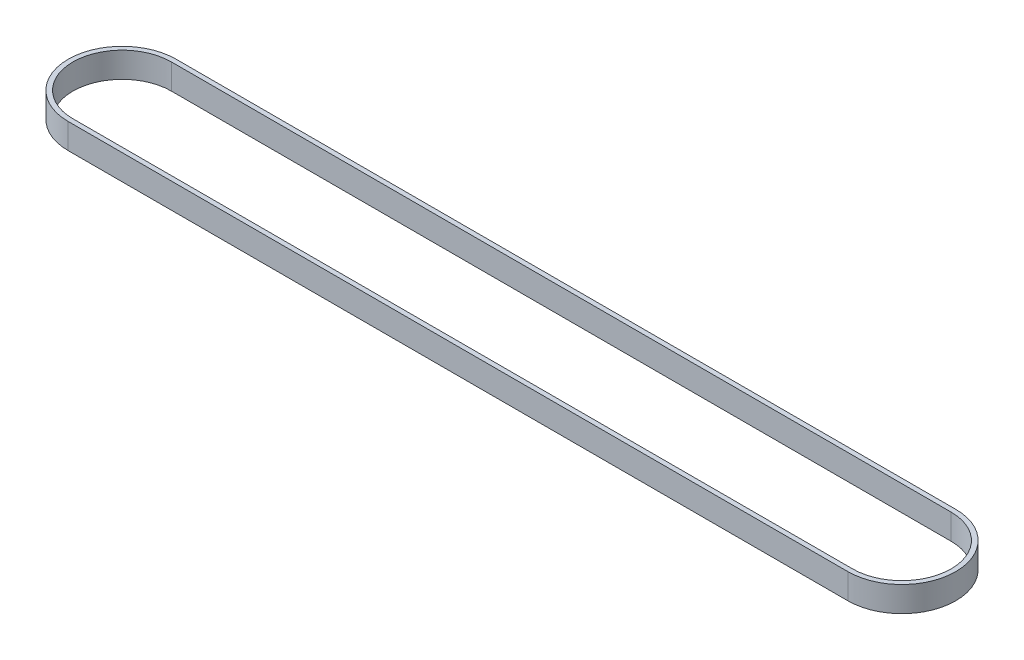
ISO-10303-21;
HEADER;
FILE_DESCRIPTION(('STEP AP214'),'2;1');
FILE_NAME('part.step','',(''),(''),'','','');
FILE_SCHEMA(('AUTOMOTIVE_DESIGN { 1 0 10303 214 1 1 1 1 }'));
ENDSEC;
DATA;
#1=APPLICATION_CONTEXT('core data for automotive mechanical design processes');
#2=APPLICATION_PROTOCOL_DEFINITION('international standard','automotive_design',2000,#1);
#3=PRODUCT_CONTEXT('',#1,'mechanical');
#4=PRODUCT('Part','Part','',(#3));
#5=PRODUCT_RELATED_PRODUCT_CATEGORY('part','',(#4));
#6=PRODUCT_DEFINITION_FORMATION('','',#4);
#7=PRODUCT_DEFINITION_CONTEXT('part definition',#1,'design');
#8=PRODUCT_DEFINITION('design','',#6,#7);
#9=PRODUCT_DEFINITION_SHAPE('','',#8);
#10=(LENGTH_UNIT() NAMED_UNIT(*) SI_UNIT(.MILLI.,.METRE.));
#11=(NAMED_UNIT(*) PLANE_ANGLE_UNIT() SI_UNIT($,.RADIAN.));
#12=(NAMED_UNIT(*) SI_UNIT($,.STERADIAN.) SOLID_ANGLE_UNIT());
#13=UNCERTAINTY_MEASURE_WITH_UNIT(LENGTH_MEASURE(1.E-05),#10,'distance_accuracy_value','');
#14=(GEOMETRIC_REPRESENTATION_CONTEXT(3) GLOBAL_UNCERTAINTY_ASSIGNED_CONTEXT((#13)) GLOBAL_UNIT_ASSIGNED_CONTEXT((#10,
#11,#12)) REPRESENTATION_CONTEXT('',''));
#15=CARTESIAN_POINT('',(0.,0.,0.));
#16=DIRECTION('',(0.,0.,1.));
#17=DIRECTION('',(1.,0.,0.));
#18=AXIS2_PLACEMENT_3D('',#15,#16,#17);
#19=CARTESIAN_POINT('',(-231.25,15.,0.));
#20=DIRECTION('',(0.,1.,0.));
#21=DIRECTION('',(0.,0.,1.));
#22=AXIS2_PLACEMENT_3D('',#19,#20,#21);
#23=PLANE('',#22);
#24=CARTESIAN_POINT('',(-231.25,15.,0.));
#25=DIRECTION('',(0.,1.,0.));
#26=DIRECTION('',(0.,0.,1.));
#27=AXIS2_PLACEMENT_3D('',#24,#25,#26);
#28=CIRCLE('',#27,32.);
#29=CARTESIAN_POINT('',(-231.25,15.,-32.));
#30=VERTEX_POINT('',#29);
#31=CARTESIAN_POINT('',(-231.25,15.,32.));
#32=VERTEX_POINT('',#31);
#33=EDGE_CURVE('E159',#30,#32,#28,.T.);
#34=ORIENTED_EDGE('',*,*,#33,.T.);
#35=DIRECTION('',(1.,0.,0.));
#36=VECTOR('',#35,1.);
#37=CARTESIAN_POINT('',(-231.25,15.,32.));
#38=LINE('',#37,#36);
#39=CARTESIAN_POINT('',(231.25,15.,32.));
#40=VERTEX_POINT('',#39);
#41=EDGE_CURVE('E163',#32,#40,#38,.T.);
#42=ORIENTED_EDGE('',*,*,#41,.T.);
#43=CARTESIAN_POINT('',(231.25,15.,0.));
#44=DIRECTION('',(0.,1.,0.));
#45=DIRECTION('',(0.,0.,1.));
#46=AXIS2_PLACEMENT_3D('',#43,#44,#45);
#47=CIRCLE('',#46,32.);
#48=CARTESIAN_POINT('',(231.25,15.,-32.0000000000001));
#49=VERTEX_POINT('',#48);
#50=EDGE_CURVE('E167',#40,#49,#47,.T.);
#51=ORIENTED_EDGE('',*,*,#50,.T.);
#52=DIRECTION('',(-1.,0.,0.));
#53=VECTOR('',#52,1.);
#54=CARTESIAN_POINT('',(-231.25,15.,-32.));
#55=LINE('',#54,#53);
#56=EDGE_CURVE('E170',#49,#30,#55,.T.);
#57=ORIENTED_EDGE('',*,*,#56,.T.);
#58=EDGE_LOOP('',(#34,#42,#51,#57));
#59=FACE_BOUND('',#58,.T.);
#60=DIRECTION('',(1.,0.,0.));
#61=VECTOR('',#60,1.);
#62=CARTESIAN_POINT('',(-231.25,15.,29.2));
#63=LINE('',#62,#61);
#64=CARTESIAN_POINT('',(-231.25,15.,29.2));
#65=VERTEX_POINT('',#64);
#66=CARTESIAN_POINT('',(231.25,15.,29.2));
#67=VERTEX_POINT('',#66);
#68=EDGE_CURVE('E120',#65,#67,#63,.T.);
#69=ORIENTED_EDGE('',*,*,#68,.F.);
#70=CARTESIAN_POINT('',(-231.25,15.,0.));
#71=DIRECTION('',(0.,1.,0.));
#72=DIRECTION('',(0.,0.,1.));
#73=AXIS2_PLACEMENT_3D('',#70,#71,#72);
#74=CIRCLE('',#73,29.2);
#75=CARTESIAN_POINT('',(-231.25,15.,-29.2));
#76=VERTEX_POINT('',#75);
#77=EDGE_CURVE('E111',#76,#65,#74,.T.);
#78=ORIENTED_EDGE('',*,*,#77,.F.);
#79=DIRECTION('',(-1.,0.,0.));
#80=VECTOR('',#79,1.);
#81=CARTESIAN_POINT('',(-231.25,15.,-29.2));
#82=LINE('',#81,#80);
#83=CARTESIAN_POINT('',(231.25,15.,-29.2000000000001));
#84=VERTEX_POINT('',#83);
#85=EDGE_CURVE('E137',#84,#76,#82,.T.);
#86=ORIENTED_EDGE('',*,*,#85,.F.);
#87=CARTESIAN_POINT('',(231.25,15.,0.));
#88=DIRECTION('',(0.,1.,0.));
#89=DIRECTION('',(0.,0.,1.));
#90=AXIS2_PLACEMENT_3D('',#87,#88,#89);
#91=CIRCLE('',#90,29.2);
#92=EDGE_CURVE('E133',#67,#84,#91,.T.);
#93=ORIENTED_EDGE('',*,*,#92,.F.);
#94=EDGE_LOOP('',(#69,#78,#86,#93));
#95=FACE_BOUND('',#94,.T.);
#96=ADVANCED_FACE('F45',(#59,#95),#23,.T.);
#97=CARTESIAN_POINT('',(-231.25,0.,0.));
#98=DIRECTION('',(0.,1.,0.));
#99=DIRECTION('',(0.,0.,1.));
#100=AXIS2_PLACEMENT_3D('',#97,#98,#99);
#101=PLANE('',#100);
#102=CARTESIAN_POINT('',(-231.25,0.,0.));
#103=DIRECTION('',(0.,1.,0.));
#104=DIRECTION('',(0.,0.,1.));
#105=AXIS2_PLACEMENT_3D('',#102,#103,#104);
#106=CIRCLE('',#105,32.);
#107=CARTESIAN_POINT('',(-231.25,0.,-32.));
#108=VERTEX_POINT('',#107);
#109=CARTESIAN_POINT('',(-231.25,0.,32.));
#110=VERTEX_POINT('',#109);
#111=EDGE_CURVE('E129',#108,#110,#106,.T.);
#112=ORIENTED_EDGE('',*,*,#111,.F.);
#113=DIRECTION('',(-1.,0.,0.));
#114=VECTOR('',#113,1.);
#115=CARTESIAN_POINT('',(-231.25,0.,-32.));
#116=LINE('',#115,#114);
#117=CARTESIAN_POINT('',(231.25,0.,-32.0000000000001));
#118=VERTEX_POINT('',#117);
#119=EDGE_CURVE('E164',#118,#108,#116,.T.);
#120=ORIENTED_EDGE('',*,*,#119,.F.);
#121=CARTESIAN_POINT('',(231.25,0.,0.));
#122=DIRECTION('',(0.,1.,0.));
#123=DIRECTION('',(0.,0.,1.));
#124=AXIS2_PLACEMENT_3D('',#121,#122,#123);
#125=CIRCLE('',#124,32.);
#126=CARTESIAN_POINT('',(231.25,0.,32.));
#127=VERTEX_POINT('',#126);
#128=EDGE_CURVE('E180',#127,#118,#125,.T.);
#129=ORIENTED_EDGE('',*,*,#128,.F.);
#130=DIRECTION('',(1.,0.,0.));
#131=VECTOR('',#130,1.);
#132=CARTESIAN_POINT('',(-231.25,0.,32.));
#133=LINE('',#132,#131);
#134=EDGE_CURVE('E177',#110,#127,#133,.T.);
#135=ORIENTED_EDGE('',*,*,#134,.F.);
#136=EDGE_LOOP('',(#112,#120,#129,#135));
#137=FACE_BOUND('',#136,.T.);
#138=CARTESIAN_POINT('',(-231.25,0.,0.));
#139=DIRECTION('',(0.,1.,0.));
#140=DIRECTION('',(0.,0.,1.));
#141=AXIS2_PLACEMENT_3D('',#138,#139,#140);
#142=CIRCLE('',#141,29.2);
#143=CARTESIAN_POINT('',(-231.25,0.,-29.2));
#144=VERTEX_POINT('',#143);
#145=CARTESIAN_POINT('',(-231.25,0.,29.2));
#146=VERTEX_POINT('',#145);
#147=EDGE_CURVE('E69',#144,#146,#142,.T.);
#148=ORIENTED_EDGE('',*,*,#147,.T.);
#149=DIRECTION('',(1.,0.,0.));
#150=VECTOR('',#149,1.);
#151=CARTESIAN_POINT('',(-231.25,0.,29.2));
#152=LINE('',#151,#150);
#153=CARTESIAN_POINT('',(231.25,0.,29.2));
#154=VERTEX_POINT('',#153);
#155=EDGE_CURVE('E127',#146,#154,#152,.T.);
#156=ORIENTED_EDGE('',*,*,#155,.T.);
#157=CARTESIAN_POINT('',(231.25,0.,0.));
#158=DIRECTION('',(0.,1.,0.));
#159=DIRECTION('',(0.,0.,1.));
#160=AXIS2_PLACEMENT_3D('',#157,#158,#159);
#161=CIRCLE('',#160,29.2);
#162=CARTESIAN_POINT('',(231.25,0.,-29.2000000000001));
#163=VERTEX_POINT('',#162);
#164=EDGE_CURVE('E146',#154,#163,#161,.T.);
#165=ORIENTED_EDGE('',*,*,#164,.T.);
#166=DIRECTION('',(-1.,0.,0.));
#167=VECTOR('',#166,1.);
#168=CARTESIAN_POINT('',(-231.25,0.,-29.2));
#169=LINE('',#168,#167);
#170=EDGE_CURVE('E121',#163,#144,#169,.T.);
#171=ORIENTED_EDGE('',*,*,#170,.T.);
#172=EDGE_LOOP('',(#148,#156,#165,#171));
#173=FACE_BOUND('',#172,.T.);
#174=ADVANCED_FACE('F203',(#137,#173),#101,.F.);
#175=CARTESIAN_POINT('',(-231.25,15.,0.));
#176=DIRECTION('',(0.,-1.,0.));
#177=DIRECTION('',(0.,0.,-1.));
#178=AXIS2_PLACEMENT_3D('',#175,#176,#177);
#179=CYLINDRICAL_SURFACE('',#178,32.);
#180=ORIENTED_EDGE('',*,*,#111,.T.);
#181=DIRECTION('',(0.,-1.,0.));
#182=VECTOR('',#181,1.);
#183=CARTESIAN_POINT('',(-231.25,15.,32.));
#184=LINE('',#183,#182);
#185=EDGE_CURVE('E11',#32,#110,#184,.T.);
#186=ORIENTED_EDGE('',*,*,#185,.F.);
#187=ORIENTED_EDGE('',*,*,#33,.F.);
#188=DIRECTION('',(0.,-1.,0.));
#189=VECTOR('',#188,1.);
#190=CARTESIAN_POINT('',(-231.25,15.,-32.));
#191=LINE('',#190,#189);
#192=EDGE_CURVE('E173',#30,#108,#191,.T.);
#193=ORIENTED_EDGE('',*,*,#192,.T.);
#194=EDGE_LOOP('',(#180,#186,#187,#193));
#195=FACE_BOUND('',#194,.T.);
#196=ADVANCED_FACE('F47',(#195),#179,.T.);
#197=CARTESIAN_POINT('',(-231.25,15.,32.));
#198=DIRECTION('',(0.,0.,-1.));
#199=DIRECTION('',(-1.,0.,0.));
#200=AXIS2_PLACEMENT_3D('',#197,#198,#199);
#201=PLANE('',#200);
#202=ORIENTED_EDGE('',*,*,#134,.T.);
#203=DIRECTION('',(0.,-1.,0.));
#204=VECTOR('',#203,1.);
#205=CARTESIAN_POINT('',(231.25,15.,32.));
#206=LINE('',#205,#204);
#207=EDGE_CURVE('E54',#40,#127,#206,.T.);
#208=ORIENTED_EDGE('',*,*,#207,.F.);
#209=ORIENTED_EDGE('',*,*,#41,.F.);
#210=ORIENTED_EDGE('',*,*,#185,.T.);
#211=EDGE_LOOP('',(#202,#208,#209,#210));
#212=FACE_BOUND('',#211,.T.);
#213=ADVANCED_FACE('F213',(#212),#201,.F.);
#214=CARTESIAN_POINT('',(231.25,15.,0.));
#215=DIRECTION('',(0.,-1.,0.));
#216=DIRECTION('',(0.,0.,-1.));
#217=AXIS2_PLACEMENT_3D('',#214,#215,#216);
#218=CYLINDRICAL_SURFACE('',#217,32.);
#219=ORIENTED_EDGE('',*,*,#128,.T.);
#220=DIRECTION('',(0.,-1.,0.));
#221=VECTOR('',#220,1.);
#222=CARTESIAN_POINT('',(231.25,15.,-32.0000000000001));
#223=LINE('',#222,#221);
#224=EDGE_CURVE('E188',#49,#118,#223,.T.);
#225=ORIENTED_EDGE('',*,*,#224,.F.);
#226=ORIENTED_EDGE('',*,*,#50,.F.);
#227=ORIENTED_EDGE('',*,*,#207,.T.);
#228=EDGE_LOOP('',(#219,#225,#226,#227));
#229=FACE_BOUND('',#228,.T.);
#230=ADVANCED_FACE('F197',(#229),#218,.T.);
#231=CARTESIAN_POINT('',(-231.25,15.,-32.));
#232=DIRECTION('',(0.,0.,1.));
#233=DIRECTION('',(1.,0.,0.));
#234=AXIS2_PLACEMENT_3D('',#231,#232,#233);
#235=PLANE('',#234);
#236=ORIENTED_EDGE('',*,*,#119,.T.);
#237=ORIENTED_EDGE('',*,*,#192,.F.);
#238=ORIENTED_EDGE('',*,*,#56,.F.);
#239=ORIENTED_EDGE('',*,*,#224,.T.);
#240=EDGE_LOOP('',(#236,#237,#238,#239));
#241=FACE_BOUND('',#240,.T.);
#242=ADVANCED_FACE('F207',(#241),#235,.F.);
#243=CARTESIAN_POINT('',(-231.25,15.,0.));
#244=DIRECTION('',(0.,-1.,0.));
#245=DIRECTION('',(0.,0.,-1.));
#246=AXIS2_PLACEMENT_3D('',#243,#244,#245);
#247=CYLINDRICAL_SURFACE('',#246,29.2);
#248=ORIENTED_EDGE('',*,*,#147,.F.);
#249=DIRECTION('',(0.,-1.,0.));
#250=VECTOR('',#249,1.);
#251=CARTESIAN_POINT('',(-231.25,15.,-29.2));
#252=LINE('',#251,#250);
#253=EDGE_CURVE('E115',#76,#144,#252,.T.);
#254=ORIENTED_EDGE('',*,*,#253,.F.);
#255=ORIENTED_EDGE('',*,*,#77,.T.);
#256=DIRECTION('',(0.,-1.,0.));
#257=VECTOR('',#256,1.);
#258=CARTESIAN_POINT('',(-231.25,15.,29.2));
#259=LINE('',#258,#257);
#260=EDGE_CURVE('E114',#65,#146,#259,.T.);
#261=ORIENTED_EDGE('',*,*,#260,.T.);
#262=EDGE_LOOP('',(#248,#254,#255,#261));
#263=FACE_BOUND('',#262,.T.);
#264=ADVANCED_FACE('F113',(#263),#247,.F.);
#265=CARTESIAN_POINT('',(-231.25,15.,29.2));
#266=DIRECTION('',(0.,0.,-1.));
#267=DIRECTION('',(-1.,0.,0.));
#268=AXIS2_PLACEMENT_3D('',#265,#266,#267);
#269=PLANE('',#268);
#270=ORIENTED_EDGE('',*,*,#155,.F.);
#271=ORIENTED_EDGE('',*,*,#260,.F.);
#272=ORIENTED_EDGE('',*,*,#68,.T.);
#273=DIRECTION('',(0.,-1.,0.));
#274=VECTOR('',#273,1.);
#275=CARTESIAN_POINT('',(231.25,15.,29.2));
#276=LINE('',#275,#274);
#277=EDGE_CURVE('E130',#67,#154,#276,.T.);
#278=ORIENTED_EDGE('',*,*,#277,.T.);
#279=EDGE_LOOP('',(#270,#271,#272,#278));
#280=FACE_BOUND('',#279,.T.);
#281=ADVANCED_FACE('F124',(#280),#269,.T.);
#282=CARTESIAN_POINT('',(231.25,15.,0.));
#283=DIRECTION('',(0.,-1.,0.));
#284=DIRECTION('',(0.,0.,-1.));
#285=AXIS2_PLACEMENT_3D('',#282,#283,#284);
#286=CYLINDRICAL_SURFACE('',#285,29.2);
#287=ORIENTED_EDGE('',*,*,#164,.F.);
#288=ORIENTED_EDGE('',*,*,#277,.F.);
#289=ORIENTED_EDGE('',*,*,#92,.T.);
#290=DIRECTION('',(0.,-1.,0.));
#291=VECTOR('',#290,1.);
#292=CARTESIAN_POINT('',(231.25,15.,-29.2000000000001));
#293=LINE('',#292,#291);
#294=EDGE_CURVE('E61',#84,#163,#293,.T.);
#295=ORIENTED_EDGE('',*,*,#294,.T.);
#296=EDGE_LOOP('',(#287,#288,#289,#295));
#297=FACE_BOUND('',#296,.T.);
#298=ADVANCED_FACE('F236',(#297),#286,.F.);
#299=CARTESIAN_POINT('',(-231.25,15.,-29.2));
#300=DIRECTION('',(0.,0.,1.));
#301=DIRECTION('',(1.,0.,0.));
#302=AXIS2_PLACEMENT_3D('',#299,#300,#301);
#303=PLANE('',#302);
#304=ORIENTED_EDGE('',*,*,#170,.F.);
#305=ORIENTED_EDGE('',*,*,#294,.F.);
#306=ORIENTED_EDGE('',*,*,#85,.T.);
#307=ORIENTED_EDGE('',*,*,#253,.T.);
#308=EDGE_LOOP('',(#304,#305,#306,#307));
#309=FACE_BOUND('',#308,.T.);
#310=ADVANCED_FACE('F240',(#309),#303,.T.);
#311=CLOSED_SHELL('',(#96,#174,#196,#213,#230,#242,#264,#281,#298,#310));
#312=MANIFOLD_SOLID_BREP('B2',#311);
#313=ADVANCED_BREP_SHAPE_REPRESENTATION('',(#18,#312),#14);
#314=SHAPE_DEFINITION_REPRESENTATION(#9,#313);
ENDSEC;
END-ISO-10303-21;
